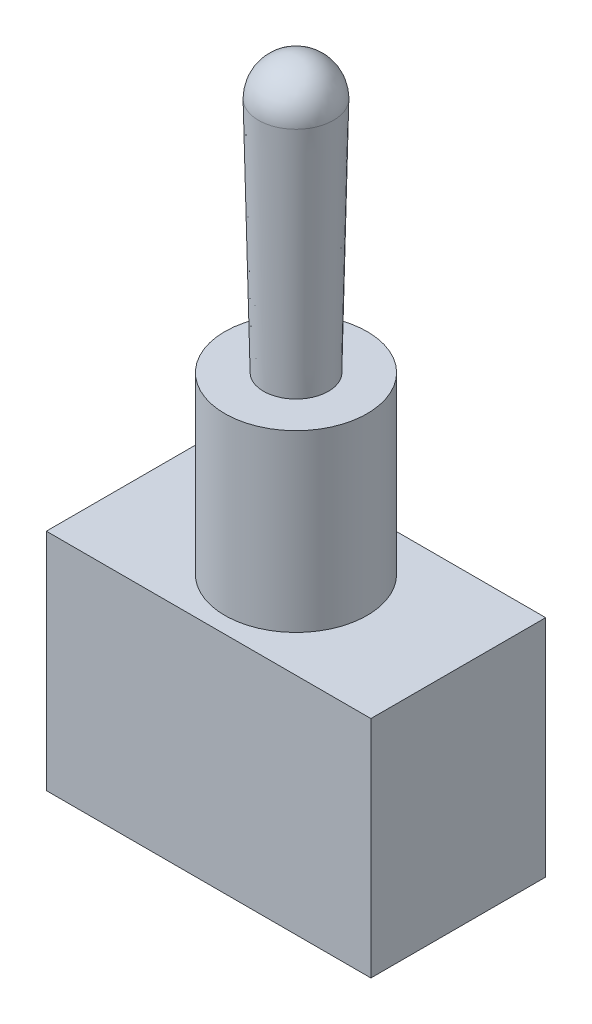
ISO-10303-21;
HEADER;
FILE_DESCRIPTION(('STEP AP214'),'2;1');
FILE_NAME('part.step','',(''),(''),'','','');
FILE_SCHEMA(('AUTOMOTIVE_DESIGN { 1 0 10303 214 1 1 1 1 }'));
ENDSEC;
DATA;
#1=APPLICATION_CONTEXT('core data for automotive mechanical design processes');
#2=APPLICATION_PROTOCOL_DEFINITION('international standard','automotive_design',2000,#1);
#3=PRODUCT_CONTEXT('',#1,'mechanical');
#4=PRODUCT('Part','Part','',(#3));
#5=PRODUCT_RELATED_PRODUCT_CATEGORY('part','',(#4));
#6=PRODUCT_DEFINITION_FORMATION('','',#4);
#7=PRODUCT_DEFINITION_CONTEXT('part definition',#1,'design');
#8=PRODUCT_DEFINITION('design','',#6,#7);
#9=PRODUCT_DEFINITION_SHAPE('','',#8);
#10=(LENGTH_UNIT() NAMED_UNIT(*) SI_UNIT(.MILLI.,.METRE.));
#11=(NAMED_UNIT(*) PLANE_ANGLE_UNIT() SI_UNIT($,.RADIAN.));
#12=(NAMED_UNIT(*) SI_UNIT($,.STERADIAN.) SOLID_ANGLE_UNIT());
#13=UNCERTAINTY_MEASURE_WITH_UNIT(LENGTH_MEASURE(1.E-05),#10,'distance_accuracy_value','');
#14=(GEOMETRIC_REPRESENTATION_CONTEXT(3) GLOBAL_UNCERTAINTY_ASSIGNED_CONTEXT((#13)) GLOBAL_UNIT_ASSIGNED_CONTEXT((#10,
#11,#12)) REPRESENTATION_CONTEXT('',''));
#15=CARTESIAN_POINT('',(0.,0.,0.));
#16=DIRECTION('',(0.,0.,1.));
#17=DIRECTION('',(1.,0.,0.));
#18=AXIS2_PLACEMENT_3D('',#15,#16,#17);
#19=CARTESIAN_POINT('',(-6.5,-4.5,7.));
#20=DIRECTION('',(1.,0.,0.));
#21=DIRECTION('',(0.,0.,-1.));
#22=AXIS2_PLACEMENT_3D('',#19,#20,#21);
#23=PLANE('',#22);
#24=DIRECTION('',(0.,-1.,0.));
#25=VECTOR('',#24,1.);
#26=CARTESIAN_POINT('',(-6.5,-4.5,0.));
#27=LINE('',#26,#25);
#28=CARTESIAN_POINT('',(-6.5,4.5,0.));
#29=VERTEX_POINT('',#28);
#30=CARTESIAN_POINT('',(-6.5,-4.5,0.));
#31=VERTEX_POINT('',#30);
#32=EDGE_CURVE('E100',#29,#31,#27,.T.);
#33=ORIENTED_EDGE('',*,*,#32,.T.);
#34=DIRECTION('',(0.,0.,-1.));
#35=VECTOR('',#34,1.);
#36=CARTESIAN_POINT('',(-6.5,-4.5,7.));
#37=LINE('',#36,#35);
#38=CARTESIAN_POINT('',(-6.5,-4.5,7.));
#39=VERTEX_POINT('',#38);
#40=EDGE_CURVE('E37',#39,#31,#37,.T.);
#41=ORIENTED_EDGE('',*,*,#40,.F.);
#42=DIRECTION('',(0.,-1.,0.));
#43=VECTOR('',#42,1.);
#44=CARTESIAN_POINT('',(-6.5,-4.5,7.));
#45=LINE('',#44,#43);
#46=CARTESIAN_POINT('',(-6.5,4.5,7.));
#47=VERTEX_POINT('',#46);
#48=EDGE_CURVE('E87',#47,#39,#45,.T.);
#49=ORIENTED_EDGE('',*,*,#48,.F.);
#50=DIRECTION('',(0.,0.,-1.));
#51=VECTOR('',#50,1.);
#52=CARTESIAN_POINT('',(-6.5,4.5,7.));
#53=LINE('',#52,#51);
#54=EDGE_CURVE('E96',#47,#29,#53,.T.);
#55=ORIENTED_EDGE('',*,*,#54,.T.);
#56=EDGE_LOOP('',(#33,#41,#49,#55));
#57=FACE_BOUND('',#56,.T.);
#58=ADVANCED_FACE('F34',(#57),#23,.F.);
#59=CARTESIAN_POINT('',(6.5,-4.5,7.));
#60=DIRECTION('',(0.,1.,0.));
#61=DIRECTION('',(-1.,0.,0.));
#62=AXIS2_PLACEMENT_3D('',#59,#60,#61);
#63=PLANE('',#62);
#64=DIRECTION('',(1.,0.,0.));
#65=VECTOR('',#64,1.);
#66=CARTESIAN_POINT('',(6.5,-4.5,0.));
#67=LINE('',#66,#65);
#68=CARTESIAN_POINT('',(6.5,-4.5,0.));
#69=VERTEX_POINT('',#68);
#70=EDGE_CURVE('E92',#31,#69,#67,.T.);
#71=ORIENTED_EDGE('',*,*,#70,.T.);
#72=DIRECTION('',(0.,0.,-1.));
#73=VECTOR('',#72,1.);
#74=CARTESIAN_POINT('',(6.5,-4.5,7.));
#75=LINE('',#74,#73);
#76=CARTESIAN_POINT('',(6.5,-4.5,7.));
#77=VERTEX_POINT('',#76);
#78=EDGE_CURVE('E90',#77,#69,#75,.T.);
#79=ORIENTED_EDGE('',*,*,#78,.F.);
#80=DIRECTION('',(1.,0.,0.));
#81=VECTOR('',#80,1.);
#82=CARTESIAN_POINT('',(6.5,-4.5,7.));
#83=LINE('',#82,#81);
#84=EDGE_CURVE('E82',#39,#77,#83,.T.);
#85=ORIENTED_EDGE('',*,*,#84,.F.);
#86=ORIENTED_EDGE('',*,*,#40,.T.);
#87=EDGE_LOOP('',(#71,#79,#85,#86));
#88=FACE_BOUND('',#87,.T.);
#89=ADVANCED_FACE('F91',(#88),#63,.F.);
#90=CARTESIAN_POINT('',(6.5,-4.5,7.));
#91=DIRECTION('',(-1.,0.,0.));
#92=DIRECTION('',(0.,-1.,0.));
#93=AXIS2_PLACEMENT_3D('',#90,#91,#92);
#94=PLANE('',#93);
#95=DIRECTION('',(0.,1.,0.));
#96=VECTOR('',#95,1.);
#97=CARTESIAN_POINT('',(6.5,-4.5,0.));
#98=LINE('',#97,#96);
#99=CARTESIAN_POINT('',(6.5,4.5,0.));
#100=VERTEX_POINT('',#99);
#101=EDGE_CURVE('E68',#69,#100,#98,.T.);
#102=ORIENTED_EDGE('',*,*,#101,.T.);
#103=DIRECTION('',(0.,0.,-1.));
#104=VECTOR('',#103,1.);
#105=CARTESIAN_POINT('',(6.5,4.5,7.));
#106=LINE('',#105,#104);
#107=CARTESIAN_POINT('',(6.5,4.5,7.));
#108=VERTEX_POINT('',#107);
#109=EDGE_CURVE('E93',#108,#100,#106,.T.);
#110=ORIENTED_EDGE('',*,*,#109,.F.);
#111=DIRECTION('',(0.,1.,0.));
#112=VECTOR('',#111,1.);
#113=CARTESIAN_POINT('',(6.5,-4.5,7.));
#114=LINE('',#113,#112);
#115=EDGE_CURVE('E85',#77,#108,#114,.T.);
#116=ORIENTED_EDGE('',*,*,#115,.F.);
#117=ORIENTED_EDGE('',*,*,#78,.T.);
#118=EDGE_LOOP('',(#102,#110,#116,#117));
#119=FACE_BOUND('',#118,.T.);
#120=ADVANCED_FACE('F94',(#119),#94,.F.);
#121=CARTESIAN_POINT('',(6.5,4.5,7.));
#122=DIRECTION('',(0.,-1.,0.));
#123=DIRECTION('',(1.,0.,0.));
#124=AXIS2_PLACEMENT_3D('',#121,#122,#123);
#125=PLANE('',#124);
#126=CARTESIAN_POINT('',(0.,4.5,3.5));
#127=DIRECTION('',(0.,1.,0.));
#128=DIRECTION('',(-1.,0.,0.));
#129=AXIS2_PLACEMENT_3D('',#126,#127,#128);
#130=CIRCLE('',#129,2.85);
#131=CARTESIAN_POINT('',(-2.85,4.5,3.5));
#132=VERTEX_POINT('',#131);
#133=EDGE_CURVE('E11',#132,#132,#130,.T.);
#134=ORIENTED_EDGE('',*,*,#133,.F.);
#135=EDGE_LOOP('',(#134));
#136=FACE_BOUND('',#135,.T.);
#137=DIRECTION('',(-1.,0.,0.));
#138=VECTOR('',#137,1.);
#139=CARTESIAN_POINT('',(6.5,4.5,0.));
#140=LINE('',#139,#138);
#141=EDGE_CURVE('E74',#100,#29,#140,.T.);
#142=ORIENTED_EDGE('',*,*,#141,.T.);
#143=ORIENTED_EDGE('',*,*,#54,.F.);
#144=DIRECTION('',(-1.,0.,0.));
#145=VECTOR('',#144,1.);
#146=CARTESIAN_POINT('',(6.5,4.5,7.));
#147=LINE('',#146,#145);
#148=EDGE_CURVE('E51',#108,#47,#147,.T.);
#149=ORIENTED_EDGE('',*,*,#148,.F.);
#150=ORIENTED_EDGE('',*,*,#109,.T.);
#151=EDGE_LOOP('',(#142,#143,#149,#150));
#152=FACE_BOUND('',#151,.T.);
#153=ADVANCED_FACE('F108',(#136,#152),#125,.F.);
#154=CARTESIAN_POINT('',(0.,0.,7.));
#155=DIRECTION('',(0.,0.,1.));
#156=DIRECTION('',(1.,0.,0.));
#157=AXIS2_PLACEMENT_3D('',#154,#155,#156);
#158=PLANE('',#157);
#159=ORIENTED_EDGE('',*,*,#48,.T.);
#160=ORIENTED_EDGE('',*,*,#84,.T.);
#161=ORIENTED_EDGE('',*,*,#115,.T.);
#162=ORIENTED_EDGE('',*,*,#148,.T.);
#163=EDGE_LOOP('',(#159,#160,#161,#162));
#164=FACE_BOUND('',#163,.T.);
#165=ADVANCED_FACE('F83',(#164),#158,.T.);
#166=CARTESIAN_POINT('',(0.,0.,0.));
#167=DIRECTION('',(0.,0.,1.));
#168=DIRECTION('',(1.,0.,0.));
#169=AXIS2_PLACEMENT_3D('',#166,#167,#168);
#170=PLANE('',#169);
#171=ORIENTED_EDGE('',*,*,#32,.F.);
#172=ORIENTED_EDGE('',*,*,#141,.F.);
#173=ORIENTED_EDGE('',*,*,#101,.F.);
#174=ORIENTED_EDGE('',*,*,#70,.F.);
#175=EDGE_LOOP('',(#171,#172,#173,#174));
#176=FACE_BOUND('',#175,.T.);
#177=ADVANCED_FACE('F111',(#176),#170,.F.);
#178=CARTESIAN_POINT('',(0.,11.5,3.5));
#179=DIRECTION('',(0.,-1.,0.));
#180=DIRECTION('',(1.,0.,0.));
#181=AXIS2_PLACEMENT_3D('',#178,#179,#180);
#182=CYLINDRICAL_SURFACE('',#181,2.85);
#183=CARTESIAN_POINT('',(0.,11.5,3.5));
#184=DIRECTION('',(0.,1.,0.));
#185=DIRECTION('',(-1.,0.,0.));
#186=AXIS2_PLACEMENT_3D('',#183,#184,#185);
#187=CIRCLE('',#186,2.85);
#188=CARTESIAN_POINT('',(-2.85,11.5,3.5));
#189=VERTEX_POINT('',#188);
#190=EDGE_CURVE('E103',#189,#189,#187,.T.);
#191=ORIENTED_EDGE('',*,*,#190,.F.);
#192=EDGE_LOOP('',(#191));
#193=FACE_BOUND('',#192,.T.);
#194=ORIENTED_EDGE('',*,*,#133,.T.);
#195=EDGE_LOOP('',(#194));
#196=FACE_BOUND('',#195,.T.);
#197=ADVANCED_FACE('F148',(#193,#196),#182,.T.);
#198=CARTESIAN_POINT('',(0.,11.5,3.5));
#199=DIRECTION('',(0.,1.,0.));
#200=DIRECTION('',(-1.,0.,0.));
#201=AXIS2_PLACEMENT_3D('',#198,#199,#200);
#202=PLANE('',#201);
#203=CARTESIAN_POINT('',(0.,11.5,3.5));
#204=DIRECTION('',(0.,-1.,0.));
#205=DIRECTION('',(0.,0.,-1.));
#206=AXIS2_PLACEMENT_3D('',#203,#204,#205);
#207=CIRCLE('',#206,1.3);
#208=CARTESIAN_POINT('',(0.,11.5,2.2));
#209=VERTEX_POINT('',#208);
#210=EDGE_CURVE('E116',#209,#209,#207,.T.);
#211=ORIENTED_EDGE('',*,*,#210,.T.);
#212=EDGE_LOOP('',(#211));
#213=FACE_BOUND('',#212,.T.);
#214=ORIENTED_EDGE('',*,*,#190,.T.);
#215=EDGE_LOOP('',(#214));
#216=FACE_BOUND('',#215,.T.);
#217=ADVANCED_FACE('F131',(#213,#216),#202,.T.);
#218=CARTESIAN_POINT('',(0.,21.,3.5));
#219=DIRECTION('',(0.,1.,0.));
#220=DIRECTION('',(0.,0.,1.));
#221=AXIS2_PLACEMENT_3D('',#218,#219,#220);
#222=CONICAL_SURFACE('',#221,1.5,0.0210495221370464);
#223=ORIENTED_EDGE('',*,*,#210,.F.);
#224=EDGE_LOOP('',(#223));
#225=FACE_BOUND('',#224,.T.);
#226=CARTESIAN_POINT('',(0.,21.,3.5));
#227=DIRECTION('',(0.,-1.,0.));
#228=DIRECTION('',(0.,0.,-1.));
#229=AXIS2_PLACEMENT_3D('',#226,#227,#228);
#230=CIRCLE('',#229,1.5);
#231=CARTESIAN_POINT('',(0.,21.,2.));
#232=VERTEX_POINT('',#231);
#233=EDGE_CURVE('E119',#232,#232,#230,.T.);
#234=ORIENTED_EDGE('',*,*,#233,.T.);
#235=EDGE_LOOP('',(#234));
#236=FACE_BOUND('',#235,.T.);
#237=ADVANCED_FACE('F123',(#225,#236),#222,.T.);
#238=CARTESIAN_POINT('',(0.,21.,3.5));
#239=DIRECTION('',(0.,-1.,0.));
#240=DIRECTION('',(0.,0.,-1.));
#241=AXIS2_PLACEMENT_3D('',#238,#239,#240);
#242=SPHERICAL_SURFACE('',#241,1.5);
#243=ORIENTED_EDGE('',*,*,#233,.F.);
#244=EDGE_LOOP('',(#243));
#245=FACE_BOUND('',#244,.T.);
#246=ADVANCED_FACE('F125',(#245),#242,.T.);
#247=CLOSED_SHELL('',(#58,#89,#120,#153,#165,#177,#197,#217,#237,#246));
#248=MANIFOLD_SOLID_BREP('B2',#247);
#249=ADVANCED_BREP_SHAPE_REPRESENTATION('',(#18,#248),#14);
#250=SHAPE_DEFINITION_REPRESENTATION(#9,#249);
ENDSEC;
END-ISO-10303-21;
